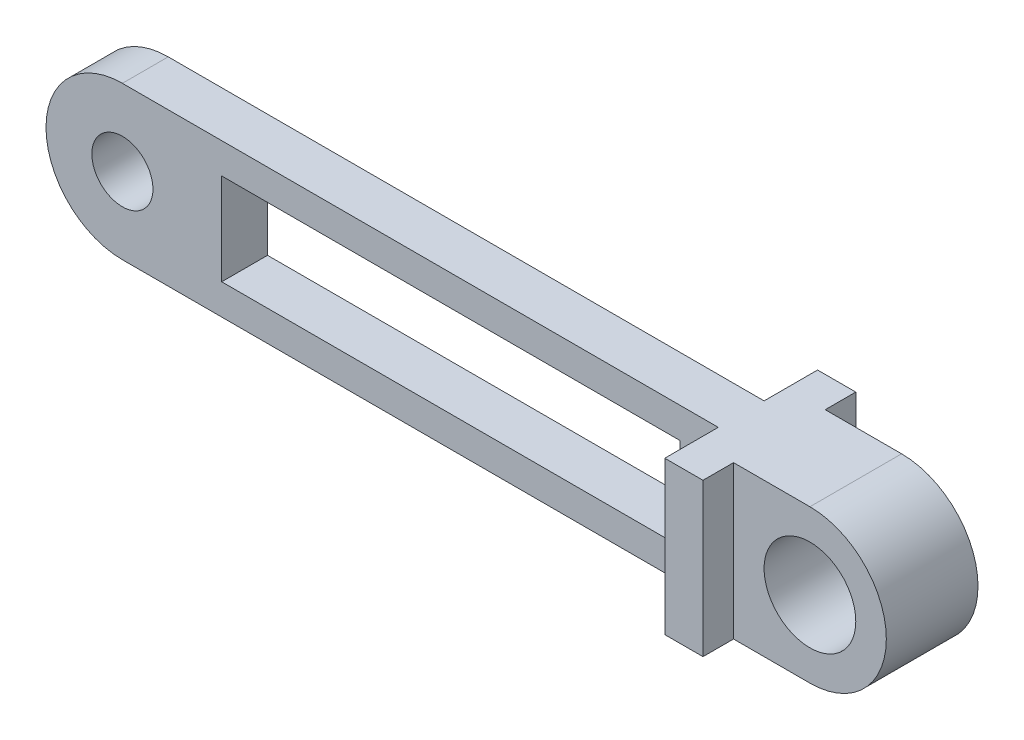
ISO-10303-21;
HEADER;
FILE_DESCRIPTION(('STEP AP214'),'2;1');
FILE_NAME('part.step','',(''),(''),'','','');
FILE_SCHEMA(('AUTOMOTIVE_DESIGN { 1 0 10303 214 1 1 1 1 }'));
ENDSEC;
DATA;
#1=APPLICATION_CONTEXT('core data for automotive mechanical design processes');
#2=APPLICATION_PROTOCOL_DEFINITION('international standard','automotive_design',2000,#1);
#3=PRODUCT_CONTEXT('',#1,'mechanical');
#4=PRODUCT('Part','Part','',(#3));
#5=PRODUCT_RELATED_PRODUCT_CATEGORY('part','',(#4));
#6=PRODUCT_DEFINITION_FORMATION('','',#4);
#7=PRODUCT_DEFINITION_CONTEXT('part definition',#1,'design');
#8=PRODUCT_DEFINITION('design','',#6,#7);
#9=PRODUCT_DEFINITION_SHAPE('','',#8);
#10=(LENGTH_UNIT() NAMED_UNIT(*) SI_UNIT(.MILLI.,.METRE.));
#11=(NAMED_UNIT(*) PLANE_ANGLE_UNIT() SI_UNIT($,.RADIAN.));
#12=(NAMED_UNIT(*) SI_UNIT($,.STERADIAN.) SOLID_ANGLE_UNIT());
#13=UNCERTAINTY_MEASURE_WITH_UNIT(LENGTH_MEASURE(1.E-05),#10,'distance_accuracy_value','');
#14=(GEOMETRIC_REPRESENTATION_CONTEXT(3) GLOBAL_UNCERTAINTY_ASSIGNED_CONTEXT((#13)) GLOBAL_UNIT_ASSIGNED_CONTEXT((#10,
#11,#12)) REPRESENTATION_CONTEXT('',''));
#15=CARTESIAN_POINT('',(0.,0.,0.));
#16=DIRECTION('',(0.,0.,1.));
#17=DIRECTION('',(1.,0.,0.));
#18=AXIS2_PLACEMENT_3D('',#15,#16,#17);
#19=CARTESIAN_POINT('',(40.,0.,0.));
#20=DIRECTION('',(1.,0.,0.));
#21=DIRECTION('',(0.,0.,-1.));
#22=AXIS2_PLACEMENT_3D('',#19,#20,#21);
#23=PLANE('',#22);
#24=DIRECTION('',(0.,0.,1.));
#25=VECTOR('',#24,1.);
#26=CARTESIAN_POINT('',(40.,10.,10.));
#27=LINE('',#26,#25);
#28=CARTESIAN_POINT('',(40.,10.,-10.));
#29=VERTEX_POINT('',#28);
#30=CARTESIAN_POINT('',(40.,10.,-6.));
#31=VERTEX_POINT('',#30);
#32=EDGE_CURVE('E330',#29,#31,#27,.T.);
#33=ORIENTED_EDGE('',*,*,#32,.T.);
#34=DIRECTION('',(0.,-1.,0.));
#35=VECTOR('',#34,1.);
#36=CARTESIAN_POINT('',(40.,-10.,-6.));
#37=LINE('',#36,#35);
#38=CARTESIAN_POINT('',(40.,-10.,-6.));
#39=VERTEX_POINT('',#38);
#40=EDGE_CURVE('E53',#31,#39,#37,.T.);
#41=ORIENTED_EDGE('',*,*,#40,.T.);
#42=DIRECTION('',(0.,0.,-1.));
#43=VECTOR('',#42,1.);
#44=CARTESIAN_POINT('',(40.,-10.,10.));
#45=LINE('',#44,#43);
#46=CARTESIAN_POINT('',(40.,-10.,-10.));
#47=VERTEX_POINT('',#46);
#48=EDGE_CURVE('E158',#39,#47,#45,.T.);
#49=ORIENTED_EDGE('',*,*,#48,.T.);
#50=DIRECTION('',(0.,1.,0.));
#51=VECTOR('',#50,1.);
#52=CARTESIAN_POINT('',(40.,10.,-10.));
#53=LINE('',#52,#51);
#54=EDGE_CURVE('E337',#47,#29,#53,.T.);
#55=ORIENTED_EDGE('',*,*,#54,.T.);
#56=EDGE_LOOP('',(#33,#41,#49,#55));
#57=FACE_BOUND('',#56,.T.);
#58=ADVANCED_FACE('F36',(#57),#23,.T.);
#59=CARTESIAN_POINT('',(-43.,0.,3.));
#60=DIRECTION('',(0.,0.,1.));
#61=DIRECTION('',(1.,0.,0.));
#62=AXIS2_PLACEMENT_3D('',#59,#60,#61);
#63=PLANE('',#62);
#64=DIRECTION('',(0.,1.,0.));
#65=VECTOR('',#64,1.);
#66=CARTESIAN_POINT('',(35.,10.,3.));
#67=LINE('',#66,#65);
#68=CARTESIAN_POINT('',(35.,-10.,3.));
#69=VERTEX_POINT('',#68);
#70=CARTESIAN_POINT('',(35.,10.,3.));
#71=VERTEX_POINT('',#70);
#72=EDGE_CURVE('E308',#69,#71,#67,.T.);
#73=ORIENTED_EDGE('',*,*,#72,.T.);
#74=DIRECTION('',(-1.,0.,0.));
#75=VECTOR('',#74,1.);
#76=CARTESIAN_POINT('',(-35.,10.,3.));
#77=LINE('',#76,#75);
#78=CARTESIAN_POINT('',(-43.,9.99999999999999,3.));
#79=VERTEX_POINT('',#78);
#80=EDGE_CURVE('E306',#71,#79,#77,.T.);
#81=ORIENTED_EDGE('',*,*,#80,.T.);
#82=CARTESIAN_POINT('',(-43.,0.,3.));
#83=DIRECTION('',(0.,0.,1.));
#84=DIRECTION('',(1.,0.,0.));
#85=AXIS2_PLACEMENT_3D('',#82,#83,#84);
#86=CIRCLE('',#85,9.99999999999999);
#87=CARTESIAN_POINT('',(-43.,-10.,3.));
#88=VERTEX_POINT('',#87);
#89=EDGE_CURVE('E302',#79,#88,#86,.T.);
#90=ORIENTED_EDGE('',*,*,#89,.T.);
#91=DIRECTION('',(1.,0.,0.));
#92=VECTOR('',#91,1.);
#93=CARTESIAN_POINT('',(-43.,-10.,3.));
#94=LINE('',#93,#92);
#95=EDGE_CURVE('E300',#88,#69,#94,.T.);
#96=ORIENTED_EDGE('',*,*,#95,.T.);
#97=EDGE_LOOP('',(#73,#81,#90,#96));
#98=FACE_BOUND('',#97,.T.);
#99=CARTESIAN_POINT('',(-43.,0.,3.));
#100=DIRECTION('',(0.,0.,1.));
#101=DIRECTION('',(1.,0.,0.));
#102=AXIS2_PLACEMENT_3D('',#99,#100,#101);
#103=CIRCLE('',#102,4.00000000000001);
#104=CARTESIAN_POINT('',(-39.,0.,3.));
#105=VERTEX_POINT('',#104);
#106=EDGE_CURVE('E324',#105,#105,#103,.T.);
#107=ORIENTED_EDGE('',*,*,#106,.F.);
#108=EDGE_LOOP('',(#107));
#109=FACE_BOUND('',#108,.T.);
#110=DIRECTION('',(-1.,0.,0.));
#111=VECTOR('',#110,1.);
#112=CARTESIAN_POINT('',(-30.,6.,3.));
#113=LINE('',#112,#111);
#114=CARTESIAN_POINT('',(30.,6.,3.));
#115=VERTEX_POINT('',#114);
#116=CARTESIAN_POINT('',(-30.,6.,3.));
#117=VERTEX_POINT('',#116);
#118=EDGE_CURVE('E417',#115,#117,#113,.T.);
#119=ORIENTED_EDGE('',*,*,#118,.F.);
#120=DIRECTION('',(0.,1.,0.));
#121=VECTOR('',#120,1.);
#122=CARTESIAN_POINT('',(30.,6.,3.));
#123=LINE('',#122,#121);
#124=CARTESIAN_POINT('',(30.,-6.,3.));
#125=VERTEX_POINT('',#124);
#126=EDGE_CURVE('E394',#125,#115,#123,.T.);
#127=ORIENTED_EDGE('',*,*,#126,.F.);
#128=DIRECTION('',(1.,0.,0.));
#129=VECTOR('',#128,1.);
#130=CARTESIAN_POINT('',(-30.,-6.,3.));
#131=LINE('',#130,#129);
#132=CARTESIAN_POINT('',(-30.,-6.,3.));
#133=VERTEX_POINT('',#132);
#134=EDGE_CURVE('E387',#133,#125,#131,.T.);
#135=ORIENTED_EDGE('',*,*,#134,.F.);
#136=DIRECTION('',(0.,-1.,0.));
#137=VECTOR('',#136,1.);
#138=CARTESIAN_POINT('',(-30.,6.,3.));
#139=LINE('',#138,#137);
#140=EDGE_CURVE('E418',#117,#133,#139,.T.);
#141=ORIENTED_EDGE('',*,*,#140,.F.);
#142=EDGE_LOOP('',(#119,#127,#135,#141));
#143=FACE_BOUND('',#142,.T.);
#144=ADVANCED_FACE('F231',(#98,#109,#143),#63,.T.);
#145=CARTESIAN_POINT('',(-43.,0.,-3.));
#146=DIRECTION('',(0.,0.,1.));
#147=DIRECTION('',(1.,0.,0.));
#148=AXIS2_PLACEMENT_3D('',#145,#146,#147);
#149=PLANE('',#148);
#150=CARTESIAN_POINT('',(-43.,0.,-3.));
#151=DIRECTION('',(0.,0.,1.));
#152=DIRECTION('',(1.,0.,0.));
#153=AXIS2_PLACEMENT_3D('',#150,#151,#152);
#154=CIRCLE('',#153,4.00000000000001);
#155=CARTESIAN_POINT('',(-39.,0.,-3.));
#156=VERTEX_POINT('',#155);
#157=EDGE_CURVE('E317',#156,#156,#154,.T.);
#158=ORIENTED_EDGE('',*,*,#157,.T.);
#159=EDGE_LOOP('',(#158));
#160=FACE_BOUND('',#159,.T.);
#161=DIRECTION('',(0.,1.,0.));
#162=VECTOR('',#161,1.);
#163=CARTESIAN_POINT('',(35.,10.,-3.));
#164=LINE('',#163,#162);
#165=CARTESIAN_POINT('',(35.,-10.,-3.));
#166=VERTEX_POINT('',#165);
#167=CARTESIAN_POINT('',(35.,10.,-3.));
#168=VERTEX_POINT('',#167);
#169=EDGE_CURVE('E321',#166,#168,#164,.T.);
#170=ORIENTED_EDGE('',*,*,#169,.F.);
#171=DIRECTION('',(1.,0.,0.));
#172=VECTOR('',#171,1.);
#173=CARTESIAN_POINT('',(-35.,-10.,-3.));
#174=LINE('',#173,#172);
#175=CARTESIAN_POINT('',(-43.,-10.,-3.));
#176=VERTEX_POINT('',#175);
#177=EDGE_CURVE('E294',#176,#166,#174,.T.);
#178=ORIENTED_EDGE('',*,*,#177,.F.);
#179=CARTESIAN_POINT('',(-43.,0.,-3.));
#180=DIRECTION('',(0.,0.,1.));
#181=DIRECTION('',(1.,0.,0.));
#182=AXIS2_PLACEMENT_3D('',#179,#180,#181);
#183=CIRCLE('',#182,9.99999999999999);
#184=CARTESIAN_POINT('',(-43.,9.99999999999999,-3.));
#185=VERTEX_POINT('',#184);
#186=EDGE_CURVE('E287',#185,#176,#183,.T.);
#187=ORIENTED_EDGE('',*,*,#186,.F.);
#188=DIRECTION('',(-1.,0.,0.));
#189=VECTOR('',#188,1.);
#190=CARTESIAN_POINT('',(-43.,9.99999999999998,-3.));
#191=LINE('',#190,#189);
#192=EDGE_CURVE('E295',#168,#185,#191,.T.);
#193=ORIENTED_EDGE('',*,*,#192,.F.);
#194=EDGE_LOOP('',(#170,#178,#187,#193));
#195=FACE_BOUND('',#194,.T.);
#196=DIRECTION('',(0.,1.,0.));
#197=VECTOR('',#196,1.);
#198=CARTESIAN_POINT('',(30.,6.,-3.));
#199=LINE('',#198,#197);
#200=CARTESIAN_POINT('',(30.,-6.,-3.));
#201=VERTEX_POINT('',#200);
#202=CARTESIAN_POINT('',(30.,6.,-3.));
#203=VERTEX_POINT('',#202);
#204=EDGE_CURVE('E376',#201,#203,#199,.T.);
#205=ORIENTED_EDGE('',*,*,#204,.T.);
#206=DIRECTION('',(-1.,0.,0.));
#207=VECTOR('',#206,1.);
#208=CARTESIAN_POINT('',(-30.,6.,-3.));
#209=LINE('',#208,#207);
#210=CARTESIAN_POINT('',(-30.,6.,-3.));
#211=VERTEX_POINT('',#210);
#212=EDGE_CURVE('E379',#203,#211,#209,.T.);
#213=ORIENTED_EDGE('',*,*,#212,.T.);
#214=DIRECTION('',(0.,-1.,0.));
#215=VECTOR('',#214,1.);
#216=CARTESIAN_POINT('',(-30.,6.,-3.));
#217=LINE('',#216,#215);
#218=CARTESIAN_POINT('',(-30.,-6.,-3.));
#219=VERTEX_POINT('',#218);
#220=EDGE_CURVE('E384',#211,#219,#217,.T.);
#221=ORIENTED_EDGE('',*,*,#220,.T.);
#222=DIRECTION('',(1.,0.,0.));
#223=VECTOR('',#222,1.);
#224=CARTESIAN_POINT('',(-30.,-6.,-3.));
#225=LINE('',#224,#223);
#226=EDGE_CURVE('E392',#219,#201,#225,.T.);
#227=ORIENTED_EDGE('',*,*,#226,.T.);
#228=EDGE_LOOP('',(#205,#213,#221,#227));
#229=FACE_BOUND('',#228,.T.);
#230=ADVANCED_FACE('F236',(#160,#195,#229),#149,.F.);
#231=CARTESIAN_POINT('',(-43.,9.99999999999998,3.));
#232=DIRECTION('',(0.,-1.,0.));
#233=DIRECTION('',(1.,0.,0.));
#234=AXIS2_PLACEMENT_3D('',#231,#232,#233);
#235=PLANE('',#234);
#236=ORIENTED_EDGE('',*,*,#192,.T.);
#237=DIRECTION('',(0.,0.,-1.));
#238=VECTOR('',#237,1.);
#239=CARTESIAN_POINT('',(-43.,9.99999999999999,3.));
#240=LINE('',#239,#238);
#241=EDGE_CURVE('E11',#79,#185,#240,.T.);
#242=ORIENTED_EDGE('',*,*,#241,.F.);
#243=ORIENTED_EDGE('',*,*,#80,.F.);
#244=DIRECTION('',(0.,0.,1.));
#245=VECTOR('',#244,1.);
#246=CARTESIAN_POINT('',(35.,10.,10.));
#247=LINE('',#246,#245);
#248=CARTESIAN_POINT('',(35.,10.,10.));
#249=VERTEX_POINT('',#248);
#250=EDGE_CURVE('E411',#71,#249,#247,.T.);
#251=ORIENTED_EDGE('',*,*,#250,.T.);
#252=DIRECTION('',(-1.,0.,0.));
#253=VECTOR('',#252,1.);
#254=CARTESIAN_POINT('',(40.,10.,10.));
#255=LINE('',#254,#253);
#256=CARTESIAN_POINT('',(40.,10.,10.));
#257=VERTEX_POINT('',#256);
#258=EDGE_CURVE('E372',#257,#249,#255,.T.);
#259=ORIENTED_EDGE('',*,*,#258,.F.);
#260=CARTESIAN_POINT('',(40.,10.,6.));
#261=VERTEX_POINT('',#260);
#262=EDGE_CURVE('E333',#261,#257,#27,.T.);
#263=ORIENTED_EDGE('',*,*,#262,.F.);
#264=DIRECTION('',(-1.,0.,0.));
#265=VECTOR('',#264,1.);
#266=CARTESIAN_POINT('',(40.,10.,6.));
#267=LINE('',#266,#265);
#268=CARTESIAN_POINT('',(50.,10.,6.));
#269=VERTEX_POINT('',#268);
#270=EDGE_CURVE('E174',#269,#261,#267,.T.);
#271=ORIENTED_EDGE('',*,*,#270,.F.);
#272=DIRECTION('',(0.,0.,-1.));
#273=VECTOR('',#272,1.);
#274=CARTESIAN_POINT('',(50.,10.,6.));
#275=LINE('',#274,#273);
#276=CARTESIAN_POINT('',(50.,10.,-6.));
#277=VERTEX_POINT('',#276);
#278=EDGE_CURVE('E205',#269,#277,#275,.T.);
#279=ORIENTED_EDGE('',*,*,#278,.T.);
#280=DIRECTION('',(-1.,0.,0.));
#281=VECTOR('',#280,1.);
#282=CARTESIAN_POINT('',(40.,10.,-6.));
#283=LINE('',#282,#281);
#284=EDGE_CURVE('E175',#277,#31,#283,.T.);
#285=ORIENTED_EDGE('',*,*,#284,.T.);
#286=ORIENTED_EDGE('',*,*,#32,.F.);
#287=DIRECTION('',(-1.,0.,0.));
#288=VECTOR('',#287,1.);
#289=CARTESIAN_POINT('',(40.,10.,-10.));
#290=LINE('',#289,#288);
#291=CARTESIAN_POINT('',(35.,10.,-10.));
#292=VERTEX_POINT('',#291);
#293=EDGE_CURVE('E358',#29,#292,#290,.T.);
#294=ORIENTED_EDGE('',*,*,#293,.T.);
#295=EDGE_CURVE('E410',#292,#168,#247,.T.);
#296=ORIENTED_EDGE('',*,*,#295,.T.);
#297=EDGE_LOOP('',(#236,#242,#243,#251,#259,#263,#271,#279,#285,#286,#294,#296));
#298=FACE_BOUND('',#297,.T.);
#299=ADVANCED_FACE('F38',(#298),#235,.F.);
#300=CARTESIAN_POINT('',(-43.,0.,3.));
#301=DIRECTION('',(0.,0.,-1.));
#302=DIRECTION('',(-1.,0.,0.));
#303=AXIS2_PLACEMENT_3D('',#300,#301,#302);
#304=CYLINDRICAL_SURFACE('',#303,9.99999999999999);
#305=ORIENTED_EDGE('',*,*,#186,.T.);
#306=DIRECTION('',(0.,0.,-1.));
#307=VECTOR('',#306,1.);
#308=CARTESIAN_POINT('',(-43.,-10.,3.));
#309=LINE('',#308,#307);
#310=EDGE_CURVE('E45',#88,#176,#309,.T.);
#311=ORIENTED_EDGE('',*,*,#310,.F.);
#312=ORIENTED_EDGE('',*,*,#89,.F.);
#313=ORIENTED_EDGE('',*,*,#241,.T.);
#314=EDGE_LOOP('',(#305,#311,#312,#313));
#315=FACE_BOUND('',#314,.T.);
#316=ADVANCED_FACE('F278',(#315),#304,.T.);
#317=CARTESIAN_POINT('',(-35.,-10.,3.));
#318=DIRECTION('',(0.,1.,0.));
#319=DIRECTION('',(0.,0.,1.));
#320=AXIS2_PLACEMENT_3D('',#317,#318,#319);
#321=PLANE('',#320);
#322=ORIENTED_EDGE('',*,*,#177,.T.);
#323=DIRECTION('',(0.,0.,-1.));
#324=VECTOR('',#323,1.);
#325=CARTESIAN_POINT('',(35.,-10.,10.));
#326=LINE('',#325,#324);
#327=CARTESIAN_POINT('',(35.,-10.,-10.));
#328=VERTEX_POINT('',#327);
#329=EDGE_CURVE('E352',#166,#328,#326,.T.);
#330=ORIENTED_EDGE('',*,*,#329,.T.);
#331=DIRECTION('',(-1.,0.,0.));
#332=VECTOR('',#331,1.);
#333=CARTESIAN_POINT('',(40.,-10.,-10.));
#334=LINE('',#333,#332);
#335=EDGE_CURVE('E157',#47,#328,#334,.T.);
#336=ORIENTED_EDGE('',*,*,#335,.F.);
#337=ORIENTED_EDGE('',*,*,#48,.F.);
#338=DIRECTION('',(1.,0.,0.));
#339=VECTOR('',#338,1.);
#340=CARTESIAN_POINT('',(50.,-10.,-6.));
#341=LINE('',#340,#339);
#342=CARTESIAN_POINT('',(50.,-10.,-6.));
#343=VERTEX_POINT('',#342);
#344=EDGE_CURVE('E196',#39,#343,#341,.T.);
#345=ORIENTED_EDGE('',*,*,#344,.T.);
#346=DIRECTION('',(0.,0.,-1.));
#347=VECTOR('',#346,1.);
#348=CARTESIAN_POINT('',(50.,-10.,6.));
#349=LINE('',#348,#347);
#350=CARTESIAN_POINT('',(50.,-10.,6.));
#351=VERTEX_POINT('',#350);
#352=EDGE_CURVE('E165',#351,#343,#349,.T.);
#353=ORIENTED_EDGE('',*,*,#352,.F.);
#354=DIRECTION('',(1.,0.,0.));
#355=VECTOR('',#354,1.);
#356=CARTESIAN_POINT('',(50.,-10.,6.));
#357=LINE('',#356,#355);
#358=CARTESIAN_POINT('',(40.,-10.,6.));
#359=VERTEX_POINT('',#358);
#360=EDGE_CURVE('E161',#359,#351,#357,.T.);
#361=ORIENTED_EDGE('',*,*,#360,.F.);
#362=CARTESIAN_POINT('',(40.,-10.,10.));
#363=VERTEX_POINT('',#362);
#364=EDGE_CURVE('E149',#363,#359,#45,.T.);
#365=ORIENTED_EDGE('',*,*,#364,.F.);
#366=DIRECTION('',(-1.,0.,0.));
#367=VECTOR('',#366,1.);
#368=CARTESIAN_POINT('',(40.,-10.,10.));
#369=LINE('',#368,#367);
#370=CARTESIAN_POINT('',(35.,-10.,10.));
#371=VERTEX_POINT('',#370);
#372=EDGE_CURVE('E355',#363,#371,#369,.T.);
#373=ORIENTED_EDGE('',*,*,#372,.T.);
#374=EDGE_CURVE('E359',#371,#69,#326,.T.);
#375=ORIENTED_EDGE('',*,*,#374,.T.);
#376=ORIENTED_EDGE('',*,*,#95,.F.);
#377=ORIENTED_EDGE('',*,*,#310,.T.);
#378=EDGE_LOOP('',(#322,#330,#336,#337,#345,#353,#361,#365,#373,#375,#376,#377));
#379=FACE_BOUND('',#378,.T.);
#380=ADVANCED_FACE('F163',(#379),#321,.F.);
#381=CARTESIAN_POINT('',(-43.,0.,3.));
#382=DIRECTION('',(0.,0.,-1.));
#383=DIRECTION('',(-1.,0.,0.));
#384=AXIS2_PLACEMENT_3D('',#381,#382,#383);
#385=CYLINDRICAL_SURFACE('',#384,4.00000000000001);
#386=ORIENTED_EDGE('',*,*,#106,.T.);
#387=EDGE_LOOP('',(#386));
#388=FACE_BOUND('',#387,.T.);
#389=ORIENTED_EDGE('',*,*,#157,.F.);
#390=EDGE_LOOP('',(#389));
#391=FACE_BOUND('',#390,.T.);
#392=ADVANCED_FACE('F269',(#388,#391),#385,.F.);
#393=CARTESIAN_POINT('',(30.,6.,3.));
#394=DIRECTION('',(-1.,0.,0.));
#395=DIRECTION('',(0.,0.,1.));
#396=AXIS2_PLACEMENT_3D('',#393,#394,#395);
#397=PLANE('',#396);
#398=ORIENTED_EDGE('',*,*,#204,.F.);
#399=DIRECTION('',(0.,0.,-1.));
#400=VECTOR('',#399,1.);
#401=CARTESIAN_POINT('',(30.,-6.,3.));
#402=LINE('',#401,#400);
#403=EDGE_CURVE('E395',#125,#201,#402,.T.);
#404=ORIENTED_EDGE('',*,*,#403,.F.);
#405=ORIENTED_EDGE('',*,*,#126,.T.);
#406=DIRECTION('',(0.,0.,-1.));
#407=VECTOR('',#406,1.);
#408=CARTESIAN_POINT('',(30.,6.,3.));
#409=LINE('',#408,#407);
#410=EDGE_CURVE('E402',#115,#203,#409,.T.);
#411=ORIENTED_EDGE('',*,*,#410,.T.);
#412=EDGE_LOOP('',(#398,#404,#405,#411));
#413=FACE_BOUND('',#412,.T.);
#414=ADVANCED_FACE('F265',(#413),#397,.T.);
#415=CARTESIAN_POINT('',(-30.,6.,3.));
#416=DIRECTION('',(0.,-1.,0.));
#417=DIRECTION('',(0.,0.,-1.));
#418=AXIS2_PLACEMENT_3D('',#415,#416,#417);
#419=PLANE('',#418);
#420=ORIENTED_EDGE('',*,*,#212,.F.);
#421=ORIENTED_EDGE('',*,*,#410,.F.);
#422=ORIENTED_EDGE('',*,*,#118,.T.);
#423=DIRECTION('',(0.,0.,-1.));
#424=VECTOR('',#423,1.);
#425=CARTESIAN_POINT('',(-30.,6.,3.));
#426=LINE('',#425,#424);
#427=EDGE_CURVE('E400',#117,#211,#426,.T.);
#428=ORIENTED_EDGE('',*,*,#427,.T.);
#429=EDGE_LOOP('',(#420,#421,#422,#428));
#430=FACE_BOUND('',#429,.T.);
#431=ADVANCED_FACE('F261',(#430),#419,.T.);
#432=CARTESIAN_POINT('',(-30.,6.,3.));
#433=DIRECTION('',(1.,0.,0.));
#434=DIRECTION('',(0.,0.,-1.));
#435=AXIS2_PLACEMENT_3D('',#432,#433,#434);
#436=PLANE('',#435);
#437=ORIENTED_EDGE('',*,*,#220,.F.);
#438=ORIENTED_EDGE('',*,*,#427,.F.);
#439=ORIENTED_EDGE('',*,*,#140,.T.);
#440=DIRECTION('',(0.,0.,-1.));
#441=VECTOR('',#440,1.);
#442=CARTESIAN_POINT('',(-30.,-6.,3.));
#443=LINE('',#442,#441);
#444=EDGE_CURVE('E398',#133,#219,#443,.T.);
#445=ORIENTED_EDGE('',*,*,#444,.T.);
#446=EDGE_LOOP('',(#437,#438,#439,#445));
#447=FACE_BOUND('',#446,.T.);
#448=ADVANCED_FACE('F257',(#447),#436,.T.);
#449=CARTESIAN_POINT('',(-30.,-6.,3.));
#450=DIRECTION('',(0.,1.,0.));
#451=DIRECTION('',(0.,0.,1.));
#452=AXIS2_PLACEMENT_3D('',#449,#450,#451);
#453=PLANE('',#452);
#454=ORIENTED_EDGE('',*,*,#226,.F.);
#455=ORIENTED_EDGE('',*,*,#444,.F.);
#456=ORIENTED_EDGE('',*,*,#134,.T.);
#457=ORIENTED_EDGE('',*,*,#403,.T.);
#458=EDGE_LOOP('',(#454,#455,#456,#457));
#459=FACE_BOUND('',#458,.T.);
#460=ADVANCED_FACE('F254',(#459),#453,.T.);
#461=CARTESIAN_POINT('',(35.,0.,0.));
#462=DIRECTION('',(1.,0.,0.));
#463=DIRECTION('',(0.,0.,-1.));
#464=AXIS2_PLACEMENT_3D('',#461,#462,#463);
#465=PLANE('',#464);
#466=ORIENTED_EDGE('',*,*,#329,.F.);
#467=ORIENTED_EDGE('',*,*,#169,.T.);
#468=ORIENTED_EDGE('',*,*,#295,.F.);
#469=DIRECTION('',(0.,1.,0.));
#470=VECTOR('',#469,1.);
#471=CARTESIAN_POINT('',(35.,10.,-10.));
#472=LINE('',#471,#470);
#473=EDGE_CURVE('E343',#328,#292,#472,.T.);
#474=ORIENTED_EDGE('',*,*,#473,.F.);
#475=EDGE_LOOP('',(#466,#467,#468,#474));
#476=FACE_BOUND('',#475,.T.);
#477=ADVANCED_FACE('F228',(#476),#465,.F.);
#478=CARTESIAN_POINT('',(40.,10.,-10.));
#479=DIRECTION('',(0.,0.,1.));
#480=DIRECTION('',(1.,0.,0.));
#481=AXIS2_PLACEMENT_3D('',#478,#479,#480);
#482=PLANE('',#481);
#483=ORIENTED_EDGE('',*,*,#473,.T.);
#484=ORIENTED_EDGE('',*,*,#293,.F.);
#485=ORIENTED_EDGE('',*,*,#54,.F.);
#486=ORIENTED_EDGE('',*,*,#335,.T.);
#487=EDGE_LOOP('',(#483,#484,#485,#486));
#488=FACE_BOUND('',#487,.T.);
#489=ADVANCED_FACE('F245',(#488),#482,.F.);
#490=CARTESIAN_POINT('',(40.,10.,10.));
#491=DIRECTION('',(0.,0.,-1.));
#492=DIRECTION('',(0.,1.,0.));
#493=AXIS2_PLACEMENT_3D('',#490,#491,#492);
#494=PLANE('',#493);
#495=DIRECTION('',(0.,-1.,0.));
#496=VECTOR('',#495,1.);
#497=CARTESIAN_POINT('',(35.,10.,10.));
#498=LINE('',#497,#496);
#499=EDGE_CURVE('E362',#249,#371,#498,.T.);
#500=ORIENTED_EDGE('',*,*,#499,.T.);
#501=ORIENTED_EDGE('',*,*,#372,.F.);
#502=DIRECTION('',(0.,-1.,0.));
#503=VECTOR('',#502,1.);
#504=CARTESIAN_POINT('',(40.,10.,10.));
#505=LINE('',#504,#503);
#506=EDGE_CURVE('E153',#257,#363,#505,.T.);
#507=ORIENTED_EDGE('',*,*,#506,.F.);
#508=ORIENTED_EDGE('',*,*,#258,.T.);
#509=EDGE_LOOP('',(#500,#501,#507,#508));
#510=FACE_BOUND('',#509,.T.);
#511=ADVANCED_FACE('F241',(#510),#494,.F.);
#512=DIRECTION('',(0.,-1.,0.));
#513=VECTOR('',#512,1.);
#514=CARTESIAN_POINT('',(40.,-10.,6.));
#515=LINE('',#514,#513);
#516=EDGE_CURVE('E61',#261,#359,#515,.T.);
#517=ORIENTED_EDGE('',*,*,#516,.F.);
#518=ORIENTED_EDGE('',*,*,#262,.T.);
#519=ORIENTED_EDGE('',*,*,#506,.T.);
#520=ORIENTED_EDGE('',*,*,#364,.T.);
#521=EDGE_LOOP('',(#517,#518,#519,#520));
#522=FACE_BOUND('',#521,.T.);
#523=ADVANCED_FACE('F151',(#522),#23,.T.);
#524=ORIENTED_EDGE('',*,*,#72,.F.);
#525=ORIENTED_EDGE('',*,*,#374,.F.);
#526=ORIENTED_EDGE('',*,*,#499,.F.);
#527=ORIENTED_EDGE('',*,*,#250,.F.);
#528=EDGE_LOOP('',(#524,#525,#526,#527));
#529=FACE_BOUND('',#528,.T.);
#530=ADVANCED_FACE('F221',(#529),#465,.F.);
#531=CARTESIAN_POINT('',(50.,0.,6.));
#532=DIRECTION('',(0.,0.,-1.));
#533=DIRECTION('',(-1.,0.,0.));
#534=AXIS2_PLACEMENT_3D('',#531,#532,#533);
#535=PLANE('',#534);
#536=ORIENTED_EDGE('',*,*,#516,.T.);
#537=ORIENTED_EDGE('',*,*,#360,.T.);
#538=CARTESIAN_POINT('',(50.,0.,6.));
#539=DIRECTION('',(0.,0.,1.));
#540=DIRECTION('',(-1.,0.,0.));
#541=AXIS2_PLACEMENT_3D('',#538,#539,#540);
#542=CIRCLE('',#541,10.);
#543=EDGE_CURVE('E168',#351,#269,#542,.T.);
#544=ORIENTED_EDGE('',*,*,#543,.T.);
#545=ORIENTED_EDGE('',*,*,#270,.T.);
#546=EDGE_LOOP('',(#536,#537,#544,#545));
#547=FACE_BOUND('',#546,.T.);
#548=CARTESIAN_POINT('',(50.,0.,6.));
#549=DIRECTION('',(0.,0.,1.));
#550=DIRECTION('',(1.,0.,0.));
#551=AXIS2_PLACEMENT_3D('',#548,#549,#550);
#552=CIRCLE('',#551,6.);
#553=CARTESIAN_POINT('',(56.,0.,6.));
#554=VERTEX_POINT('',#553);
#555=EDGE_CURVE('E197',#554,#554,#552,.T.);
#556=ORIENTED_EDGE('',*,*,#555,.F.);
#557=EDGE_LOOP('',(#556));
#558=FACE_BOUND('',#557,.T.);
#559=ADVANCED_FACE('F171',(#547,#558),#535,.F.);
#560=CARTESIAN_POINT('',(50.,0.,-6.));
#561=DIRECTION('',(0.,0.,-1.));
#562=DIRECTION('',(-1.,0.,0.));
#563=AXIS2_PLACEMENT_3D('',#560,#561,#562);
#564=PLANE('',#563);
#565=ORIENTED_EDGE('',*,*,#40,.F.);
#566=ORIENTED_EDGE('',*,*,#284,.F.);
#567=CARTESIAN_POINT('',(50.,0.,-6.));
#568=DIRECTION('',(0.,0.,1.));
#569=DIRECTION('',(-1.,0.,0.));
#570=AXIS2_PLACEMENT_3D('',#567,#568,#569);
#571=CIRCLE('',#570,10.);
#572=EDGE_CURVE('E178',#343,#277,#571,.T.);
#573=ORIENTED_EDGE('',*,*,#572,.F.);
#574=ORIENTED_EDGE('',*,*,#344,.F.);
#575=EDGE_LOOP('',(#565,#566,#573,#574));
#576=FACE_BOUND('',#575,.T.);
#577=CARTESIAN_POINT('',(50.,0.,-6.));
#578=DIRECTION('',(0.,0.,1.));
#579=DIRECTION('',(1.,0.,0.));
#580=AXIS2_PLACEMENT_3D('',#577,#578,#579);
#581=CIRCLE('',#580,6.);
#582=CARTESIAN_POINT('',(56.,0.,-6.));
#583=VERTEX_POINT('',#582);
#584=EDGE_CURVE('E188',#583,#583,#581,.T.);
#585=ORIENTED_EDGE('',*,*,#584,.T.);
#586=EDGE_LOOP('',(#585));
#587=FACE_BOUND('',#586,.T.);
#588=ADVANCED_FACE('F209',(#576,#587),#564,.T.);
#589=CARTESIAN_POINT('',(50.,0.,6.));
#590=DIRECTION('',(0.,0.,-1.));
#591=DIRECTION('',(-1.,0.,0.));
#592=AXIS2_PLACEMENT_3D('',#589,#590,#591);
#593=CYLINDRICAL_SURFACE('',#592,10.);
#594=ORIENTED_EDGE('',*,*,#572,.T.);
#595=ORIENTED_EDGE('',*,*,#278,.F.);
#596=ORIENTED_EDGE('',*,*,#543,.F.);
#597=ORIENTED_EDGE('',*,*,#352,.T.);
#598=EDGE_LOOP('',(#594,#595,#596,#597));
#599=FACE_BOUND('',#598,.T.);
#600=ADVANCED_FACE('F204',(#599),#593,.T.);
#601=CARTESIAN_POINT('',(50.,0.,6.));
#602=DIRECTION('',(0.,0.,-1.));
#603=DIRECTION('',(-1.,0.,0.));
#604=AXIS2_PLACEMENT_3D('',#601,#602,#603);
#605=CYLINDRICAL_SURFACE('',#604,6.);
#606=ORIENTED_EDGE('',*,*,#555,.T.);
#607=EDGE_LOOP('',(#606));
#608=FACE_BOUND('',#607,.T.);
#609=ORIENTED_EDGE('',*,*,#584,.F.);
#610=EDGE_LOOP('',(#609));
#611=FACE_BOUND('',#610,.T.);
#612=ADVANCED_FACE('F219',(#608,#611),#605,.F.);
#613=CLOSED_SHELL('',(#58,#144,#230,#299,#316,#380,#392,#414,#431,#448,#460,#477,#489,#511,#523,
#530,#559,#588,#600,#612));
#614=MANIFOLD_SOLID_BREP('B2',#613);
#615=ADVANCED_BREP_SHAPE_REPRESENTATION('',(#18,#614),#14);
#616=SHAPE_DEFINITION_REPRESENTATION(#9,#615);
ENDSEC;
END-ISO-10303-21;
